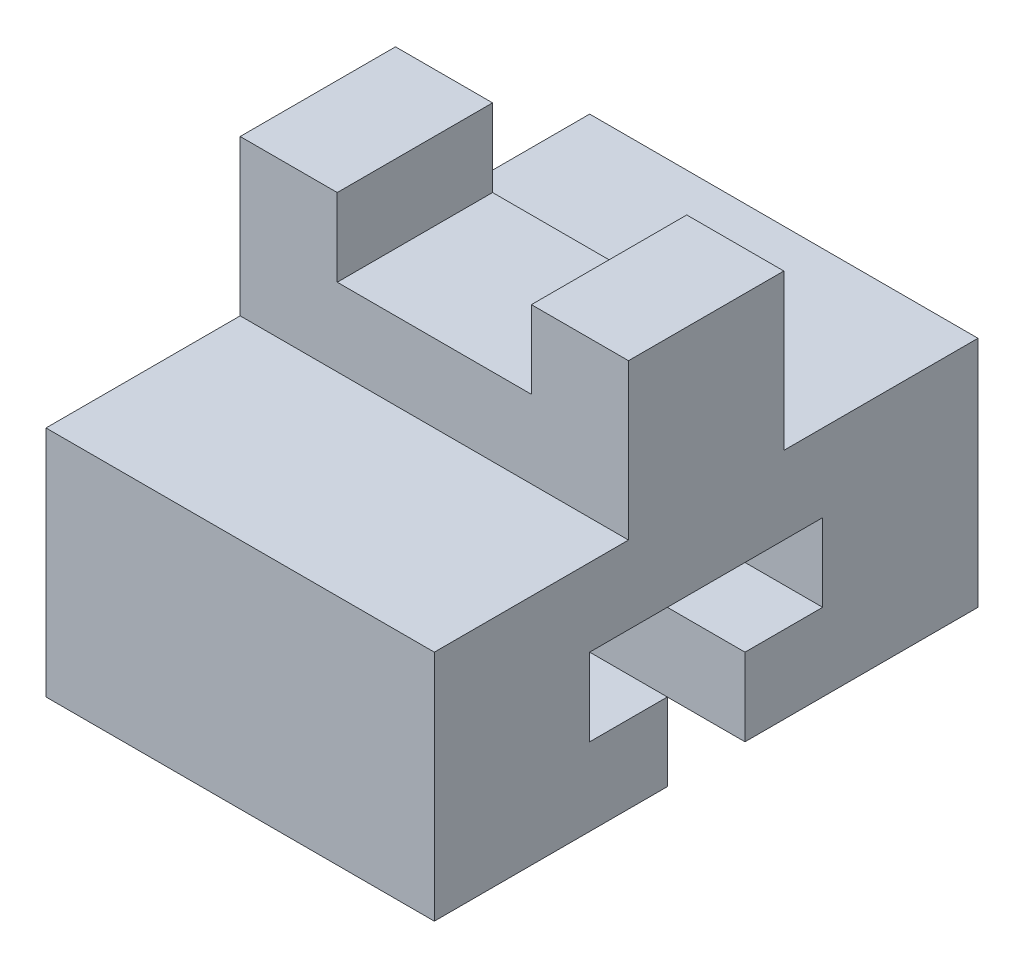
ISO-10303-21;
HEADER;
FILE_DESCRIPTION(('STEP AP214'),'2;1');
FILE_NAME('part.step','',(''),(''),'','','');
FILE_SCHEMA(('AUTOMOTIVE_DESIGN { 1 0 10303 214 1 1 1 1 }'));
ENDSEC;
DATA;
#1=APPLICATION_CONTEXT('core data for automotive mechanical design processes');
#2=APPLICATION_PROTOCOL_DEFINITION('international standard','automotive_design',2000,#1);
#3=PRODUCT_CONTEXT('',#1,'mechanical');
#4=PRODUCT('Part','Part','',(#3));
#5=PRODUCT_RELATED_PRODUCT_CATEGORY('part','',(#4));
#6=PRODUCT_DEFINITION_FORMATION('','',#4);
#7=PRODUCT_DEFINITION_CONTEXT('part definition',#1,'design');
#8=PRODUCT_DEFINITION('design','',#6,#7);
#9=PRODUCT_DEFINITION_SHAPE('','',#8);
#10=(LENGTH_UNIT() NAMED_UNIT(*) SI_UNIT(.MILLI.,.METRE.));
#11=(NAMED_UNIT(*) PLANE_ANGLE_UNIT() SI_UNIT($,.RADIAN.));
#12=(NAMED_UNIT(*) SI_UNIT($,.STERADIAN.) SOLID_ANGLE_UNIT());
#13=UNCERTAINTY_MEASURE_WITH_UNIT(LENGTH_MEASURE(1.E-05),#10,'distance_accuracy_value','');
#14=(GEOMETRIC_REPRESENTATION_CONTEXT(3) GLOBAL_UNCERTAINTY_ASSIGNED_CONTEXT((#13)) GLOBAL_UNIT_ASSIGNED_CONTEXT((#10,
#11,#12)) REPRESENTATION_CONTEXT('',''));
#15=CARTESIAN_POINT('',(0.,0.,0.));
#16=DIRECTION('',(0.,0.,1.));
#17=DIRECTION('',(1.,0.,0.));
#18=AXIS2_PLACEMENT_3D('',#15,#16,#17);
#19=CARTESIAN_POINT('',(-50.,50.,-45.));
#20=DIRECTION('',(0.,1.,0.));
#21=DIRECTION('',(0.,0.,1.));
#22=AXIS2_PLACEMENT_3D('',#19,#20,#21);
#23=PLANE('',#22);
#24=DIRECTION('',(0.,0.,1.));
#25=VECTOR('',#24,1.);
#26=CARTESIAN_POINT('',(-37.5,50.,-70.));
#27=LINE('',#26,#25);
#28=CARTESIAN_POINT('',(-37.5,50.,-45.));
#29=VERTEX_POINT('',#28);
#30=CARTESIAN_POINT('',(-37.5,50.,-25.));
#31=VERTEX_POINT('',#30);
#32=EDGE_CURVE('E204',#29,#31,#27,.T.);
#33=ORIENTED_EDGE('',*,*,#32,.F.);
#34=DIRECTION('',(1.,0.,0.));
#35=VECTOR('',#34,1.);
#36=CARTESIAN_POINT('',(-50.,50.,-45.));
#37=LINE('',#36,#35);
#38=CARTESIAN_POINT('',(-50.,50.,-45.));
#39=VERTEX_POINT('',#38);
#40=EDGE_CURVE('E192',#39,#29,#37,.T.);
#41=ORIENTED_EDGE('',*,*,#40,.F.);
#42=DIRECTION('',(0.,0.,1.));
#43=VECTOR('',#42,1.);
#44=CARTESIAN_POINT('',(-50.,50.,-45.));
#45=LINE('',#44,#43);
#46=CARTESIAN_POINT('',(-50.,50.,-25.));
#47=VERTEX_POINT('',#46);
#48=EDGE_CURVE('E187',#39,#47,#45,.T.);
#49=ORIENTED_EDGE('',*,*,#48,.T.);
#50=DIRECTION('',(1.,0.,0.));
#51=VECTOR('',#50,1.);
#52=CARTESIAN_POINT('',(-50.,50.,-25.));
#53=LINE('',#52,#51);
#54=EDGE_CURVE('E168',#47,#31,#53,.T.);
#55=ORIENTED_EDGE('',*,*,#54,.T.);
#56=EDGE_LOOP('',(#33,#41,#49,#55));
#57=FACE_BOUND('',#56,.T.);
#58=ADVANCED_FACE('F37',(#57),#23,.T.);
#59=CARTESIAN_POINT('',(-50.,30.,0.));
#60=DIRECTION('',(0.,0.,1.));
#61=DIRECTION('',(1.,0.,0.));
#62=AXIS2_PLACEMENT_3D('',#59,#60,#61);
#63=PLANE('',#62);
#64=DIRECTION('',(0.,-1.,0.));
#65=VECTOR('',#64,1.);
#66=CARTESIAN_POINT('',(0.,30.,0.));
#67=LINE('',#66,#65);
#68=CARTESIAN_POINT('',(0.,30.,0.));
#69=VERTEX_POINT('',#68);
#70=CARTESIAN_POINT('',(0.,0.,0.));
#71=VERTEX_POINT('',#70);
#72=EDGE_CURVE('E200',#69,#71,#67,.T.);
#73=ORIENTED_EDGE('',*,*,#72,.F.);
#74=DIRECTION('',(1.,0.,0.));
#75=VECTOR('',#74,1.);
#76=CARTESIAN_POINT('',(-50.,30.,0.));
#77=LINE('',#76,#75);
#78=CARTESIAN_POINT('',(-50.,30.,0.));
#79=VERTEX_POINT('',#78);
#80=EDGE_CURVE('E61',#79,#69,#77,.T.);
#81=ORIENTED_EDGE('',*,*,#80,.F.);
#82=DIRECTION('',(0.,-1.,0.));
#83=VECTOR('',#82,1.);
#84=CARTESIAN_POINT('',(-50.,30.,0.));
#85=LINE('',#84,#83);
#86=CARTESIAN_POINT('',(-50.,0.,0.));
#87=VERTEX_POINT('',#86);
#88=EDGE_CURVE('E249',#79,#87,#85,.T.);
#89=ORIENTED_EDGE('',*,*,#88,.T.);
#90=DIRECTION('',(1.,0.,0.));
#91=VECTOR('',#90,1.);
#92=CARTESIAN_POINT('',(-50.,0.,0.));
#93=LINE('',#92,#91);
#94=EDGE_CURVE('E124',#87,#71,#93,.T.);
#95=ORIENTED_EDGE('',*,*,#94,.T.);
#96=EDGE_LOOP('',(#73,#81,#89,#95));
#97=FACE_BOUND('',#96,.T.);
#98=ADVANCED_FACE('F39',(#97),#63,.T.);
#99=CARTESIAN_POINT('',(-50.,30.,-25.));
#100=DIRECTION('',(0.,1.,0.));
#101=DIRECTION('',(0.,0.,1.));
#102=AXIS2_PLACEMENT_3D('',#99,#100,#101);
#103=PLANE('',#102);
#104=DIRECTION('',(0.,0.,1.));
#105=VECTOR('',#104,1.);
#106=CARTESIAN_POINT('',(0.,30.,-25.));
#107=LINE('',#106,#105);
#108=CARTESIAN_POINT('',(0.,30.,-25.));
#109=VERTEX_POINT('',#108);
#110=EDGE_CURVE('E246',#109,#69,#107,.T.);
#111=ORIENTED_EDGE('',*,*,#110,.F.);
#112=DIRECTION('',(1.,0.,0.));
#113=VECTOR('',#112,1.);
#114=CARTESIAN_POINT('',(-50.,30.,-25.));
#115=LINE('',#114,#113);
#116=CARTESIAN_POINT('',(-50.,30.,-25.));
#117=VERTEX_POINT('',#116);
#118=EDGE_CURVE('E180',#117,#109,#115,.T.);
#119=ORIENTED_EDGE('',*,*,#118,.F.);
#120=DIRECTION('',(0.,0.,1.));
#121=VECTOR('',#120,1.);
#122=CARTESIAN_POINT('',(-50.,30.,-25.));
#123=LINE('',#122,#121);
#124=EDGE_CURVE('E189',#117,#79,#123,.T.);
#125=ORIENTED_EDGE('',*,*,#124,.T.);
#126=ORIENTED_EDGE('',*,*,#80,.T.);
#127=EDGE_LOOP('',(#111,#119,#125,#126));
#128=FACE_BOUND('',#127,.T.);
#129=ADVANCED_FACE('F384',(#128),#103,.T.);
#130=CARTESIAN_POINT('',(-50.,50.,-25.));
#131=DIRECTION('',(0.,0.,1.));
#132=DIRECTION('',(1.,0.,0.));
#133=AXIS2_PLACEMENT_3D('',#130,#131,#132);
#134=PLANE('',#133);
#135=DIRECTION('',(0.,-1.,0.));
#136=VECTOR('',#135,1.);
#137=CARTESIAN_POINT('',(-37.5,50.,-25.));
#138=LINE('',#137,#136);
#139=CARTESIAN_POINT('',(-37.5,40.,-25.));
#140=VERTEX_POINT('',#139);
#141=EDGE_CURVE('E176',#31,#140,#138,.T.);
#142=ORIENTED_EDGE('',*,*,#141,.F.);
#143=ORIENTED_EDGE('',*,*,#54,.F.);
#144=DIRECTION('',(0.,-1.,0.));
#145=VECTOR('',#144,1.);
#146=CARTESIAN_POINT('',(-50.,50.,-25.));
#147=LINE('',#146,#145);
#148=EDGE_CURVE('E171',#47,#117,#147,.T.);
#149=ORIENTED_EDGE('',*,*,#148,.T.);
#150=ORIENTED_EDGE('',*,*,#118,.T.);
#151=DIRECTION('',(0.,-1.,0.));
#152=VECTOR('',#151,1.);
#153=CARTESIAN_POINT('',(0.,50.,-25.));
#154=LINE('',#153,#152);
#155=CARTESIAN_POINT('',(0.,50.,-25.));
#156=VERTEX_POINT('',#155);
#157=EDGE_CURVE('E243',#156,#109,#154,.T.);
#158=ORIENTED_EDGE('',*,*,#157,.F.);
#159=CARTESIAN_POINT('',(-12.5,50.,-25.));
#160=VERTEX_POINT('',#159);
#161=EDGE_CURVE('E181',#160,#156,#53,.T.);
#162=ORIENTED_EDGE('',*,*,#161,.F.);
#163=DIRECTION('',(0.,1.,0.));
#164=VECTOR('',#163,1.);
#165=CARTESIAN_POINT('',(-12.5,50.,-25.));
#166=LINE('',#165,#164);
#167=CARTESIAN_POINT('',(-12.5,40.,-25.));
#168=VERTEX_POINT('',#167);
#169=EDGE_CURVE('E302',#168,#160,#166,.T.);
#170=ORIENTED_EDGE('',*,*,#169,.F.);
#171=DIRECTION('',(1.,0.,0.));
#172=VECTOR('',#171,1.);
#173=CARTESIAN_POINT('',(-37.5,40.,-25.));
#174=LINE('',#173,#172);
#175=EDGE_CURVE('E305',#140,#168,#174,.T.);
#176=ORIENTED_EDGE('',*,*,#175,.F.);
#177=EDGE_LOOP('',(#142,#143,#149,#150,#158,#162,#170,#176));
#178=FACE_BOUND('',#177,.T.);
#179=ADVANCED_FACE('F170',(#178),#134,.T.);
#180=DIRECTION('',(0.,0.,1.));
#181=VECTOR('',#180,1.);
#182=CARTESIAN_POINT('',(-12.5,50.,-70.));
#183=LINE('',#182,#181);
#184=CARTESIAN_POINT('',(-12.5,50.,-45.));
#185=VERTEX_POINT('',#184);
#186=EDGE_CURVE('E287',#185,#160,#183,.T.);
#187=ORIENTED_EDGE('',*,*,#186,.T.);
#188=ORIENTED_EDGE('',*,*,#161,.T.);
#189=DIRECTION('',(0.,0.,1.));
#190=VECTOR('',#189,1.);
#191=CARTESIAN_POINT('',(0.,50.,-45.));
#192=LINE('',#191,#190);
#193=CARTESIAN_POINT('',(0.,50.,-45.));
#194=VERTEX_POINT('',#193);
#195=EDGE_CURVE('E240',#194,#156,#192,.T.);
#196=ORIENTED_EDGE('',*,*,#195,.F.);
#197=EDGE_CURVE('E254',#185,#194,#37,.T.);
#198=ORIENTED_EDGE('',*,*,#197,.F.);
#199=EDGE_LOOP('',(#187,#188,#196,#198));
#200=FACE_BOUND('',#199,.T.);
#201=ADVANCED_FACE('F390',(#200),#23,.T.);
#202=CARTESIAN_POINT('',(-50.,30.,-45.));
#203=DIRECTION('',(0.,0.,-1.));
#204=DIRECTION('',(-1.,0.,0.));
#205=AXIS2_PLACEMENT_3D('',#202,#203,#204);
#206=PLANE('',#205);
#207=DIRECTION('',(0.,1.,0.));
#208=VECTOR('',#207,1.);
#209=CARTESIAN_POINT('',(-37.5,30.,-45.));
#210=LINE('',#209,#208);
#211=CARTESIAN_POINT('',(-37.5,40.,-45.));
#212=VERTEX_POINT('',#211);
#213=EDGE_CURVE('E11',#212,#29,#210,.T.);
#214=ORIENTED_EDGE('',*,*,#213,.F.);
#215=DIRECTION('',(-1.,0.,0.));
#216=VECTOR('',#215,1.);
#217=CARTESIAN_POINT('',(-50.,40.,-45.));
#218=LINE('',#217,#216);
#219=CARTESIAN_POINT('',(-12.5,40.,-45.));
#220=VERTEX_POINT('',#219);
#221=EDGE_CURVE('E251',#220,#212,#218,.T.);
#222=ORIENTED_EDGE('',*,*,#221,.F.);
#223=DIRECTION('',(0.,-1.,0.));
#224=VECTOR('',#223,1.);
#225=CARTESIAN_POINT('',(-12.5,30.,-45.));
#226=LINE('',#225,#224);
#227=EDGE_CURVE('E45',#185,#220,#226,.T.);
#228=ORIENTED_EDGE('',*,*,#227,.F.);
#229=ORIENTED_EDGE('',*,*,#197,.T.);
#230=DIRECTION('',(0.,1.,0.));
#231=VECTOR('',#230,1.);
#232=CARTESIAN_POINT('',(0.,30.,-45.));
#233=LINE('',#232,#231);
#234=CARTESIAN_POINT('',(0.,30.,-45.));
#235=VERTEX_POINT('',#234);
#236=EDGE_CURVE('E237',#235,#194,#233,.T.);
#237=ORIENTED_EDGE('',*,*,#236,.F.);
#238=DIRECTION('',(1.,0.,0.));
#239=VECTOR('',#238,1.);
#240=CARTESIAN_POINT('',(-50.,30.,-45.));
#241=LINE('',#240,#239);
#242=CARTESIAN_POINT('',(-50.,30.,-45.));
#243=VERTEX_POINT('',#242);
#244=EDGE_CURVE('E255',#243,#235,#241,.T.);
#245=ORIENTED_EDGE('',*,*,#244,.F.);
#246=DIRECTION('',(0.,1.,0.));
#247=VECTOR('',#246,1.);
#248=CARTESIAN_POINT('',(-50.,30.,-45.));
#249=LINE('',#248,#247);
#250=EDGE_CURVE('E193',#243,#39,#249,.T.);
#251=ORIENTED_EDGE('',*,*,#250,.T.);
#252=ORIENTED_EDGE('',*,*,#40,.T.);
#253=EDGE_LOOP('',(#214,#222,#228,#229,#237,#245,#251,#252));
#254=FACE_BOUND('',#253,.T.);
#255=ADVANCED_FACE('F291',(#254),#206,.T.);
#256=CARTESIAN_POINT('',(-50.,30.,-70.));
#257=DIRECTION('',(0.,1.,0.));
#258=DIRECTION('',(0.,0.,1.));
#259=AXIS2_PLACEMENT_3D('',#256,#257,#258);
#260=PLANE('',#259);
#261=DIRECTION('',(0.,0.,1.));
#262=VECTOR('',#261,1.);
#263=CARTESIAN_POINT('',(0.,30.,-70.));
#264=LINE('',#263,#262);
#265=CARTESIAN_POINT('',(0.,30.,-70.));
#266=VERTEX_POINT('',#265);
#267=EDGE_CURVE('E234',#266,#235,#264,.T.);
#268=ORIENTED_EDGE('',*,*,#267,.F.);
#269=DIRECTION('',(1.,0.,0.));
#270=VECTOR('',#269,1.);
#271=CARTESIAN_POINT('',(-50.,30.,-70.));
#272=LINE('',#271,#270);
#273=CARTESIAN_POINT('',(-50.,30.,-70.));
#274=VERTEX_POINT('',#273);
#275=EDGE_CURVE('E257',#274,#266,#272,.T.);
#276=ORIENTED_EDGE('',*,*,#275,.F.);
#277=DIRECTION('',(0.,0.,1.));
#278=VECTOR('',#277,1.);
#279=CARTESIAN_POINT('',(-50.,30.,-70.));
#280=LINE('',#279,#278);
#281=EDGE_CURVE('E195',#274,#243,#280,.T.);
#282=ORIENTED_EDGE('',*,*,#281,.T.);
#283=ORIENTED_EDGE('',*,*,#244,.T.);
#284=EDGE_LOOP('',(#268,#276,#282,#283));
#285=FACE_BOUND('',#284,.T.);
#286=ADVANCED_FACE('F342',(#285),#260,.T.);
#287=CARTESIAN_POINT('',(-50.,0.,-70.));
#288=DIRECTION('',(0.,0.,-1.));
#289=DIRECTION('',(-1.,0.,0.));
#290=AXIS2_PLACEMENT_3D('',#287,#288,#289);
#291=PLANE('',#290);
#292=DIRECTION('',(0.,1.,0.));
#293=VECTOR('',#292,1.);
#294=CARTESIAN_POINT('',(0.,0.,-70.));
#295=LINE('',#294,#293);
#296=CARTESIAN_POINT('',(0.,0.,-70.));
#297=VERTEX_POINT('',#296);
#298=EDGE_CURVE('E231',#297,#266,#295,.T.);
#299=ORIENTED_EDGE('',*,*,#298,.F.);
#300=DIRECTION('',(1.,0.,0.));
#301=VECTOR('',#300,1.);
#302=CARTESIAN_POINT('',(-50.,0.,-70.));
#303=LINE('',#302,#301);
#304=CARTESIAN_POINT('',(-50.,0.,-70.));
#305=VERTEX_POINT('',#304);
#306=EDGE_CURVE('E259',#305,#297,#303,.T.);
#307=ORIENTED_EDGE('',*,*,#306,.F.);
#308=DIRECTION('',(0.,1.,0.));
#309=VECTOR('',#308,1.);
#310=CARTESIAN_POINT('',(-50.,0.,-70.));
#311=LINE('',#310,#309);
#312=EDGE_CURVE('E336',#305,#274,#311,.T.);
#313=ORIENTED_EDGE('',*,*,#312,.T.);
#314=ORIENTED_EDGE('',*,*,#275,.T.);
#315=EDGE_LOOP('',(#299,#307,#313,#314));
#316=FACE_BOUND('',#315,.T.);
#317=ADVANCED_FACE('F348',(#316),#291,.T.);
#318=CARTESIAN_POINT('',(-50.,0.,-40.));
#319=DIRECTION('',(0.,-1.,0.));
#320=DIRECTION('',(0.,0.,-1.));
#321=AXIS2_PLACEMENT_3D('',#318,#319,#320);
#322=PLANE('',#321);
#323=DIRECTION('',(0.,0.,-1.));
#324=VECTOR('',#323,1.);
#325=CARTESIAN_POINT('',(0.,0.,-40.));
#326=LINE('',#325,#324);
#327=CARTESIAN_POINT('',(0.,0.,-40.));
#328=VERTEX_POINT('',#327);
#329=EDGE_CURVE('E228',#328,#297,#326,.T.);
#330=ORIENTED_EDGE('',*,*,#329,.F.);
#331=DIRECTION('',(1.,0.,0.));
#332=VECTOR('',#331,1.);
#333=CARTESIAN_POINT('',(-50.,0.,-40.));
#334=LINE('',#333,#332);
#335=CARTESIAN_POINT('',(-50.,0.,-40.));
#336=VERTEX_POINT('',#335);
#337=EDGE_CURVE('E261',#336,#328,#334,.T.);
#338=ORIENTED_EDGE('',*,*,#337,.F.);
#339=DIRECTION('',(0.,0.,-1.));
#340=VECTOR('',#339,1.);
#341=CARTESIAN_POINT('',(-50.,0.,-40.));
#342=LINE('',#341,#340);
#343=EDGE_CURVE('E333',#336,#305,#342,.T.);
#344=ORIENTED_EDGE('',*,*,#343,.T.);
#345=ORIENTED_EDGE('',*,*,#306,.T.);
#346=EDGE_LOOP('',(#330,#338,#344,#345));
#347=FACE_BOUND('',#346,.T.);
#348=ADVANCED_FACE('F351',(#347),#322,.T.);
#349=CARTESIAN_POINT('',(-50.,10.,-40.));
#350=DIRECTION('',(0.,0.,1.));
#351=DIRECTION('',(1.,0.,0.));
#352=AXIS2_PLACEMENT_3D('',#349,#350,#351);
#353=PLANE('',#352);
#354=DIRECTION('',(0.,-1.,0.));
#355=VECTOR('',#354,1.);
#356=CARTESIAN_POINT('',(0.,10.,-40.));
#357=LINE('',#356,#355);
#358=CARTESIAN_POINT('',(0.,10.,-40.));
#359=VERTEX_POINT('',#358);
#360=EDGE_CURVE('E225',#359,#328,#357,.T.);
#361=ORIENTED_EDGE('',*,*,#360,.F.);
#362=DIRECTION('',(1.,0.,0.));
#363=VECTOR('',#362,1.);
#364=CARTESIAN_POINT('',(-50.,10.,-40.));
#365=LINE('',#364,#363);
#366=CARTESIAN_POINT('',(-50.,10.,-40.));
#367=VERTEX_POINT('',#366);
#368=EDGE_CURVE('E263',#367,#359,#365,.T.);
#369=ORIENTED_EDGE('',*,*,#368,.F.);
#370=DIRECTION('',(0.,-1.,0.));
#371=VECTOR('',#370,1.);
#372=CARTESIAN_POINT('',(-50.,10.,-40.));
#373=LINE('',#372,#371);
#374=EDGE_CURVE('E330',#367,#336,#373,.T.);
#375=ORIENTED_EDGE('',*,*,#374,.T.);
#376=ORIENTED_EDGE('',*,*,#337,.T.);
#377=EDGE_LOOP('',(#361,#369,#375,#376));
#378=FACE_BOUND('',#377,.T.);
#379=ADVANCED_FACE('F356',(#378),#353,.T.);
#380=CARTESIAN_POINT('',(-50.,10.,-50.));
#381=DIRECTION('',(0.,1.,0.));
#382=DIRECTION('',(0.,0.,1.));
#383=AXIS2_PLACEMENT_3D('',#380,#381,#382);
#384=PLANE('',#383);
#385=DIRECTION('',(0.,0.,1.));
#386=VECTOR('',#385,1.);
#387=CARTESIAN_POINT('',(0.,10.,-50.));
#388=LINE('',#387,#386);
#389=CARTESIAN_POINT('',(0.,10.,-50.));
#390=VERTEX_POINT('',#389);
#391=EDGE_CURVE('E222',#390,#359,#388,.T.);
#392=ORIENTED_EDGE('',*,*,#391,.F.);
#393=DIRECTION('',(1.,0.,0.));
#394=VECTOR('',#393,1.);
#395=CARTESIAN_POINT('',(-50.,10.,-50.));
#396=LINE('',#395,#394);
#397=CARTESIAN_POINT('',(-50.,10.,-50.));
#398=VERTEX_POINT('',#397);
#399=EDGE_CURVE('E265',#398,#390,#396,.T.);
#400=ORIENTED_EDGE('',*,*,#399,.F.);
#401=DIRECTION('',(0.,0.,1.));
#402=VECTOR('',#401,1.);
#403=CARTESIAN_POINT('',(-50.,10.,-50.));
#404=LINE('',#403,#402);
#405=EDGE_CURVE('E327',#398,#367,#404,.T.);
#406=ORIENTED_EDGE('',*,*,#405,.T.);
#407=ORIENTED_EDGE('',*,*,#368,.T.);
#408=EDGE_LOOP('',(#392,#400,#406,#407));
#409=FACE_BOUND('',#408,.T.);
#410=ADVANCED_FACE('F359',(#409),#384,.T.);
#411=CARTESIAN_POINT('',(-50.,20.,-50.));
#412=DIRECTION('',(0.,0.,1.));
#413=DIRECTION('',(1.,0.,0.));
#414=AXIS2_PLACEMENT_3D('',#411,#412,#413);
#415=PLANE('',#414);
#416=DIRECTION('',(0.,-1.,0.));
#417=VECTOR('',#416,1.);
#418=CARTESIAN_POINT('',(0.,20.,-50.));
#419=LINE('',#418,#417);
#420=CARTESIAN_POINT('',(0.,20.,-50.));
#421=VERTEX_POINT('',#420);
#422=EDGE_CURVE('E219',#421,#390,#419,.T.);
#423=ORIENTED_EDGE('',*,*,#422,.F.);
#424=DIRECTION('',(1.,0.,0.));
#425=VECTOR('',#424,1.);
#426=CARTESIAN_POINT('',(-50.,20.,-50.));
#427=LINE('',#426,#425);
#428=CARTESIAN_POINT('',(-50.,20.,-50.));
#429=VERTEX_POINT('',#428);
#430=EDGE_CURVE('E267',#429,#421,#427,.T.);
#431=ORIENTED_EDGE('',*,*,#430,.F.);
#432=DIRECTION('',(0.,-1.,0.));
#433=VECTOR('',#432,1.);
#434=CARTESIAN_POINT('',(-50.,20.,-50.));
#435=LINE('',#434,#433);
#436=EDGE_CURVE('E324',#429,#398,#435,.T.);
#437=ORIENTED_EDGE('',*,*,#436,.T.);
#438=ORIENTED_EDGE('',*,*,#399,.T.);
#439=EDGE_LOOP('',(#423,#431,#437,#438));
#440=FACE_BOUND('',#439,.T.);
#441=ADVANCED_FACE('F364',(#440),#415,.T.);
#442=CARTESIAN_POINT('',(-50.,20.,-20.));
#443=DIRECTION('',(0.,-1.,0.));
#444=DIRECTION('',(0.,0.,-1.));
#445=AXIS2_PLACEMENT_3D('',#442,#443,#444);
#446=PLANE('',#445);
#447=DIRECTION('',(0.,0.,-1.));
#448=VECTOR('',#447,1.);
#449=CARTESIAN_POINT('',(0.,20.,-20.));
#450=LINE('',#449,#448);
#451=CARTESIAN_POINT('',(0.,20.,-20.));
#452=VERTEX_POINT('',#451);
#453=EDGE_CURVE('E216',#452,#421,#450,.T.);
#454=ORIENTED_EDGE('',*,*,#453,.F.);
#455=DIRECTION('',(1.,0.,0.));
#456=VECTOR('',#455,1.);
#457=CARTESIAN_POINT('',(-50.,20.,-20.));
#458=LINE('',#457,#456);
#459=CARTESIAN_POINT('',(-50.,20.,-20.));
#460=VERTEX_POINT('',#459);
#461=EDGE_CURVE('E269',#460,#452,#458,.T.);
#462=ORIENTED_EDGE('',*,*,#461,.F.);
#463=DIRECTION('',(0.,0.,-1.));
#464=VECTOR('',#463,1.);
#465=CARTESIAN_POINT('',(-50.,20.,-20.));
#466=LINE('',#465,#464);
#467=EDGE_CURVE('E321',#460,#429,#466,.T.);
#468=ORIENTED_EDGE('',*,*,#467,.T.);
#469=ORIENTED_EDGE('',*,*,#430,.T.);
#470=EDGE_LOOP('',(#454,#462,#468,#469));
#471=FACE_BOUND('',#470,.T.);
#472=ADVANCED_FACE('F367',(#471),#446,.T.);
#473=CARTESIAN_POINT('',(-50.,10.,-20.));
#474=DIRECTION('',(0.,0.,-1.));
#475=DIRECTION('',(-1.,0.,0.));
#476=AXIS2_PLACEMENT_3D('',#473,#474,#475);
#477=PLANE('',#476);
#478=DIRECTION('',(0.,1.,0.));
#479=VECTOR('',#478,1.);
#480=CARTESIAN_POINT('',(0.,10.,-20.));
#481=LINE('',#480,#479);
#482=CARTESIAN_POINT('',(0.,10.,-20.));
#483=VERTEX_POINT('',#482);
#484=EDGE_CURVE('E213',#483,#452,#481,.T.);
#485=ORIENTED_EDGE('',*,*,#484,.F.);
#486=DIRECTION('',(1.,0.,0.));
#487=VECTOR('',#486,1.);
#488=CARTESIAN_POINT('',(-50.,10.,-20.));
#489=LINE('',#488,#487);
#490=CARTESIAN_POINT('',(-50.,10.,-20.));
#491=VERTEX_POINT('',#490);
#492=EDGE_CURVE('E271',#491,#483,#489,.T.);
#493=ORIENTED_EDGE('',*,*,#492,.F.);
#494=DIRECTION('',(0.,1.,0.));
#495=VECTOR('',#494,1.);
#496=CARTESIAN_POINT('',(-50.,10.,-20.));
#497=LINE('',#496,#495);
#498=EDGE_CURVE('E318',#491,#460,#497,.T.);
#499=ORIENTED_EDGE('',*,*,#498,.T.);
#500=ORIENTED_EDGE('',*,*,#461,.T.);
#501=EDGE_LOOP('',(#485,#493,#499,#500));
#502=FACE_BOUND('',#501,.T.);
#503=ADVANCED_FACE('F372',(#502),#477,.T.);
#504=CARTESIAN_POINT('',(-50.,10.,-30.));
#505=DIRECTION('',(0.,1.,0.));
#506=DIRECTION('',(0.,0.,1.));
#507=AXIS2_PLACEMENT_3D('',#504,#505,#506);
#508=PLANE('',#507);
#509=DIRECTION('',(0.,0.,1.));
#510=VECTOR('',#509,1.);
#511=CARTESIAN_POINT('',(0.,10.,-30.));
#512=LINE('',#511,#510);
#513=CARTESIAN_POINT('',(0.,10.,-30.));
#514=VERTEX_POINT('',#513);
#515=EDGE_CURVE('E210',#514,#483,#512,.T.);
#516=ORIENTED_EDGE('',*,*,#515,.F.);
#517=DIRECTION('',(1.,0.,0.));
#518=VECTOR('',#517,1.);
#519=CARTESIAN_POINT('',(-50.,10.,-30.));
#520=LINE('',#519,#518);
#521=CARTESIAN_POINT('',(-50.,10.,-30.));
#522=VERTEX_POINT('',#521);
#523=EDGE_CURVE('E273',#522,#514,#520,.T.);
#524=ORIENTED_EDGE('',*,*,#523,.F.);
#525=DIRECTION('',(0.,0.,1.));
#526=VECTOR('',#525,1.);
#527=CARTESIAN_POINT('',(-50.,10.,-30.));
#528=LINE('',#527,#526);
#529=EDGE_CURVE('E315',#522,#491,#528,.T.);
#530=ORIENTED_EDGE('',*,*,#529,.T.);
#531=ORIENTED_EDGE('',*,*,#492,.T.);
#532=EDGE_LOOP('',(#516,#524,#530,#531));
#533=FACE_BOUND('',#532,.T.);
#534=ADVANCED_FACE('F375',(#533),#508,.T.);
#535=CARTESIAN_POINT('',(-50.,0.,-30.));
#536=DIRECTION('',(0.,0.,-1.));
#537=DIRECTION('',(-1.,0.,0.));
#538=AXIS2_PLACEMENT_3D('',#535,#536,#537);
#539=PLANE('',#538);
#540=DIRECTION('',(0.,1.,0.));
#541=VECTOR('',#540,1.);
#542=CARTESIAN_POINT('',(0.,0.,-30.));
#543=LINE('',#542,#541);
#544=CARTESIAN_POINT('',(0.,0.,-30.));
#545=VERTEX_POINT('',#544);
#546=EDGE_CURVE('E207',#545,#514,#543,.T.);
#547=ORIENTED_EDGE('',*,*,#546,.F.);
#548=DIRECTION('',(1.,0.,0.));
#549=VECTOR('',#548,1.);
#550=CARTESIAN_POINT('',(-50.,0.,-30.));
#551=LINE('',#550,#549);
#552=CARTESIAN_POINT('',(-50.,0.,-30.));
#553=VERTEX_POINT('',#552);
#554=EDGE_CURVE('E275',#553,#545,#551,.T.);
#555=ORIENTED_EDGE('',*,*,#554,.F.);
#556=DIRECTION('',(0.,1.,0.));
#557=VECTOR('',#556,1.);
#558=CARTESIAN_POINT('',(-50.,0.,-30.));
#559=LINE('',#558,#557);
#560=EDGE_CURVE('E312',#553,#522,#559,.T.);
#561=ORIENTED_EDGE('',*,*,#560,.T.);
#562=ORIENTED_EDGE('',*,*,#523,.T.);
#563=EDGE_LOOP('',(#547,#555,#561,#562));
#564=FACE_BOUND('',#563,.T.);
#565=ADVANCED_FACE('F379',(#564),#539,.T.);
#566=CARTESIAN_POINT('',(-50.,0.,0.));
#567=DIRECTION('',(0.,-1.,0.));
#568=DIRECTION('',(0.,0.,-1.));
#569=AXIS2_PLACEMENT_3D('',#566,#567,#568);
#570=PLANE('',#569);
#571=DIRECTION('',(0.,0.,-1.));
#572=VECTOR('',#571,1.);
#573=CARTESIAN_POINT('',(0.,0.,0.));
#574=LINE('',#573,#572);
#575=EDGE_CURVE('E203',#71,#545,#574,.T.);
#576=ORIENTED_EDGE('',*,*,#575,.F.);
#577=ORIENTED_EDGE('',*,*,#94,.F.);
#578=DIRECTION('',(0.,0.,-1.));
#579=VECTOR('',#578,1.);
#580=CARTESIAN_POINT('',(-50.,0.,0.));
#581=LINE('',#580,#579);
#582=EDGE_CURVE('E310',#87,#553,#581,.T.);
#583=ORIENTED_EDGE('',*,*,#582,.T.);
#584=ORIENTED_EDGE('',*,*,#554,.T.);
#585=EDGE_LOOP('',(#576,#577,#583,#584));
#586=FACE_BOUND('',#585,.T.);
#587=ADVANCED_FACE('F380',(#586),#570,.T.);
#588=CARTESIAN_POINT('',(-50.,0.,0.));
#589=DIRECTION('',(1.,0.,0.));
#590=DIRECTION('',(0.,0.,-1.));
#591=AXIS2_PLACEMENT_3D('',#588,#589,#590);
#592=PLANE('',#591);
#593=ORIENTED_EDGE('',*,*,#88,.F.);
#594=ORIENTED_EDGE('',*,*,#124,.F.);
#595=ORIENTED_EDGE('',*,*,#148,.F.);
#596=ORIENTED_EDGE('',*,*,#48,.F.);
#597=ORIENTED_EDGE('',*,*,#250,.F.);
#598=ORIENTED_EDGE('',*,*,#281,.F.);
#599=ORIENTED_EDGE('',*,*,#312,.F.);
#600=ORIENTED_EDGE('',*,*,#343,.F.);
#601=ORIENTED_EDGE('',*,*,#374,.F.);
#602=ORIENTED_EDGE('',*,*,#405,.F.);
#603=ORIENTED_EDGE('',*,*,#436,.F.);
#604=ORIENTED_EDGE('',*,*,#467,.F.);
#605=ORIENTED_EDGE('',*,*,#498,.F.);
#606=ORIENTED_EDGE('',*,*,#529,.F.);
#607=ORIENTED_EDGE('',*,*,#560,.F.);
#608=ORIENTED_EDGE('',*,*,#582,.F.);
#609=EDGE_LOOP('',(#593,#594,#595,#596,#597,#598,#599,#600,#601,#602,#603,#604,#605,#606,#607,#608));
#610=FACE_BOUND('',#609,.T.);
#611=ADVANCED_FACE('F185',(#610),#592,.F.);
#612=CARTESIAN_POINT('',(0.,0.,0.));
#613=DIRECTION('',(1.,0.,0.));
#614=DIRECTION('',(0.,0.,-1.));
#615=AXIS2_PLACEMENT_3D('',#612,#613,#614);
#616=PLANE('',#615);
#617=ORIENTED_EDGE('',*,*,#72,.T.);
#618=ORIENTED_EDGE('',*,*,#575,.T.);
#619=ORIENTED_EDGE('',*,*,#546,.T.);
#620=ORIENTED_EDGE('',*,*,#515,.T.);
#621=ORIENTED_EDGE('',*,*,#484,.T.);
#622=ORIENTED_EDGE('',*,*,#453,.T.);
#623=ORIENTED_EDGE('',*,*,#422,.T.);
#624=ORIENTED_EDGE('',*,*,#391,.T.);
#625=ORIENTED_EDGE('',*,*,#360,.T.);
#626=ORIENTED_EDGE('',*,*,#329,.T.);
#627=ORIENTED_EDGE('',*,*,#298,.T.);
#628=ORIENTED_EDGE('',*,*,#267,.T.);
#629=ORIENTED_EDGE('',*,*,#236,.T.);
#630=ORIENTED_EDGE('',*,*,#195,.T.);
#631=ORIENTED_EDGE('',*,*,#157,.T.);
#632=ORIENTED_EDGE('',*,*,#110,.T.);
#633=EDGE_LOOP('',(#617,#618,#619,#620,#621,#622,#623,#624,#625,#626,#627,#628,#629,#630,#631,#632));
#634=FACE_BOUND('',#633,.T.);
#635=ADVANCED_FACE('F382',(#634),#616,.T.);
#636=CARTESIAN_POINT('',(-37.5,50.,-70.));
#637=DIRECTION('',(-1.,0.,0.));
#638=DIRECTION('',(0.,0.,1.));
#639=AXIS2_PLACEMENT_3D('',#636,#637,#638);
#640=PLANE('',#639);
#641=ORIENTED_EDGE('',*,*,#213,.T.);
#642=ORIENTED_EDGE('',*,*,#32,.T.);
#643=ORIENTED_EDGE('',*,*,#141,.T.);
#644=DIRECTION('',(0.,0.,1.));
#645=VECTOR('',#644,1.);
#646=CARTESIAN_POINT('',(-37.5,40.,-70.));
#647=LINE('',#646,#645);
#648=EDGE_CURVE('E297',#212,#140,#647,.T.);
#649=ORIENTED_EDGE('',*,*,#648,.F.);
#650=EDGE_LOOP('',(#641,#642,#643,#649));
#651=FACE_BOUND('',#650,.T.);
#652=ADVANCED_FACE('F300',(#651),#640,.F.);
#653=CARTESIAN_POINT('',(-12.5,50.,-70.));
#654=DIRECTION('',(1.,0.,0.));
#655=DIRECTION('',(0.,0.,-1.));
#656=AXIS2_PLACEMENT_3D('',#653,#654,#655);
#657=PLANE('',#656);
#658=ORIENTED_EDGE('',*,*,#227,.T.);
#659=DIRECTION('',(0.,0.,1.));
#660=VECTOR('',#659,1.);
#661=CARTESIAN_POINT('',(-12.5,40.,-70.));
#662=LINE('',#661,#660);
#663=EDGE_CURVE('E52',#220,#168,#662,.T.);
#664=ORIENTED_EDGE('',*,*,#663,.T.);
#665=ORIENTED_EDGE('',*,*,#169,.T.);
#666=ORIENTED_EDGE('',*,*,#186,.F.);
#667=EDGE_LOOP('',(#658,#664,#665,#666));
#668=FACE_BOUND('',#667,.T.);
#669=ADVANCED_FACE('F282',(#668),#657,.F.);
#670=CARTESIAN_POINT('',(-37.5,40.,-70.));
#671=DIRECTION('',(0.,-1.,0.));
#672=DIRECTION('',(0.,0.,-1.));
#673=AXIS2_PLACEMENT_3D('',#670,#671,#672);
#674=PLANE('',#673);
#675=ORIENTED_EDGE('',*,*,#221,.T.);
#676=ORIENTED_EDGE('',*,*,#648,.T.);
#677=ORIENTED_EDGE('',*,*,#175,.T.);
#678=ORIENTED_EDGE('',*,*,#663,.F.);
#679=EDGE_LOOP('',(#675,#676,#677,#678));
#680=FACE_BOUND('',#679,.T.);
#681=ADVANCED_FACE('F295',(#680),#674,.F.);
#682=CLOSED_SHELL('',(#58,#98,#129,#179,#201,#255,#286,#317,#348,#379,#410,#441,#472,#503,#534,
#565,#587,#611,#635,#652,#669,#681));
#683=MANIFOLD_SOLID_BREP('B2',#682);
#684=ADVANCED_BREP_SHAPE_REPRESENTATION('',(#18,#683),#14);
#685=SHAPE_DEFINITION_REPRESENTATION(#9,#684);
ENDSEC;
END-ISO-10303-21;
